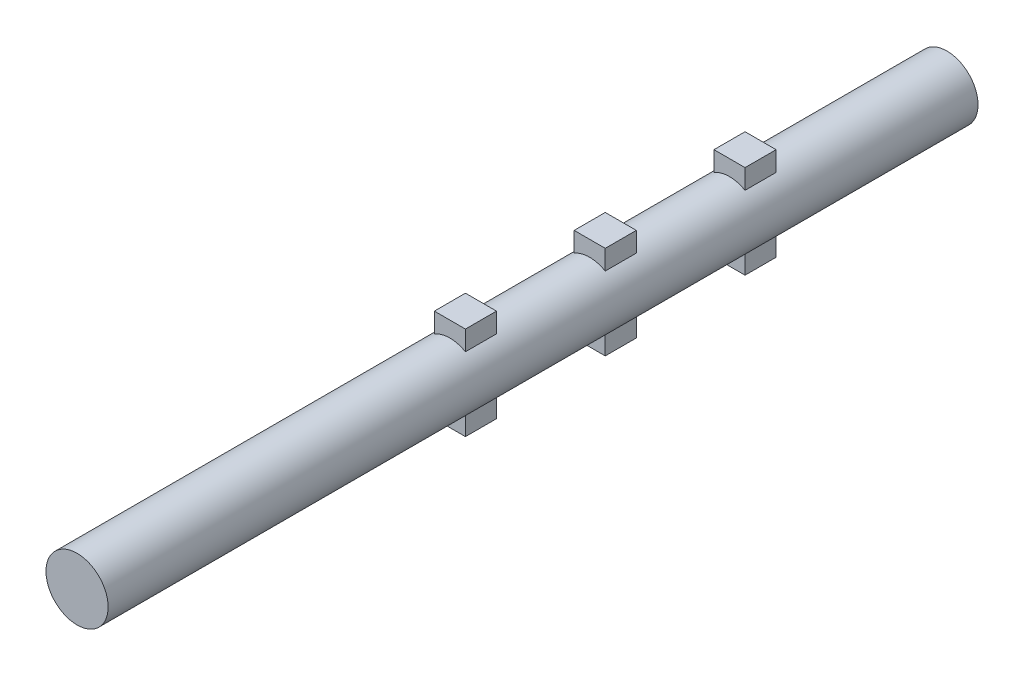
ISO-10303-21;
HEADER;
FILE_DESCRIPTION(('STEP AP214'),'2;1');
FILE_NAME('part.step','',(''),(''),'','','');
FILE_SCHEMA(('AUTOMOTIVE_DESIGN { 1 0 10303 214 1 1 1 1 }'));
ENDSEC;
DATA;
#1=APPLICATION_CONTEXT('core data for automotive mechanical design processes');
#2=APPLICATION_PROTOCOL_DEFINITION('international standard','automotive_design',2000,#1);
#3=PRODUCT_CONTEXT('',#1,'mechanical');
#4=PRODUCT('Part','Part','',(#3));
#5=PRODUCT_RELATED_PRODUCT_CATEGORY('part','',(#4));
#6=PRODUCT_DEFINITION_FORMATION('','',#4);
#7=PRODUCT_DEFINITION_CONTEXT('part definition',#1,'design');
#8=PRODUCT_DEFINITION('design','',#6,#7);
#9=PRODUCT_DEFINITION_SHAPE('','',#8);
#10=(LENGTH_UNIT() NAMED_UNIT(*) SI_UNIT(.MILLI.,.METRE.));
#11=(NAMED_UNIT(*) PLANE_ANGLE_UNIT() SI_UNIT($,.RADIAN.));
#12=(NAMED_UNIT(*) SI_UNIT($,.STERADIAN.) SOLID_ANGLE_UNIT());
#13=UNCERTAINTY_MEASURE_WITH_UNIT(LENGTH_MEASURE(1.E-05),#10,'distance_accuracy_value','');
#14=(GEOMETRIC_REPRESENTATION_CONTEXT(3) GLOBAL_UNCERTAINTY_ASSIGNED_CONTEXT((#13)) GLOBAL_UNIT_ASSIGNED_CONTEXT((#10,
#11,#12)) REPRESENTATION_CONTEXT('',''));
#15=CARTESIAN_POINT('',(0.,0.,0.));
#16=DIRECTION('',(0.,0.,1.));
#17=DIRECTION('',(1.,0.,0.));
#18=AXIS2_PLACEMENT_3D('',#15,#16,#17);
#19=CARTESIAN_POINT('',(0.,0.,25.));
#20=DIRECTION('',(0.,0.,1.));
#21=DIRECTION('',(1.,0.,0.));
#22=AXIS2_PLACEMENT_3D('',#19,#20,#21);
#23=PLANE('',#22);
#24=CARTESIAN_POINT('',(0.,0.,25.));
#25=DIRECTION('',(0.,0.,1.));
#26=DIRECTION('',(1.,0.,0.));
#27=AXIS2_PLACEMENT_3D('',#24,#25,#26);
#28=CIRCLE('',#27,5.);
#29=CARTESIAN_POINT('',(2.5,4.33012701892219,25.));
#30=VERTEX_POINT('',#29);
#31=CARTESIAN_POINT('',(-2.5,4.33012701892219,25.));
#32=VERTEX_POINT('',#31);
#33=EDGE_CURVE('E53',#30,#32,#28,.T.);
#34=ORIENTED_EDGE('',*,*,#33,.F.);
#35=DIRECTION('',(0.,1.,0.));
#36=VECTOR('',#35,1.);
#37=CARTESIAN_POINT('',(2.5,-7.5,25.));
#38=LINE('',#37,#36);
#39=CARTESIAN_POINT('',(2.5,7.5,25.));
#40=VERTEX_POINT('',#39);
#41=EDGE_CURVE('E222',#30,#40,#38,.T.);
#42=ORIENTED_EDGE('',*,*,#41,.T.);
#43=DIRECTION('',(-1.,0.,0.));
#44=VECTOR('',#43,1.);
#45=CARTESIAN_POINT('',(-2.5,7.5,25.));
#46=LINE('',#45,#44);
#47=CARTESIAN_POINT('',(-2.5,7.5,25.));
#48=VERTEX_POINT('',#47);
#49=EDGE_CURVE('E397',#40,#48,#46,.T.);
#50=ORIENTED_EDGE('',*,*,#49,.T.);
#51=DIRECTION('',(0.,-1.,0.));
#52=VECTOR('',#51,1.);
#53=CARTESIAN_POINT('',(-2.5,-7.5,25.));
#54=LINE('',#53,#52);
#55=EDGE_CURVE('E234',#48,#32,#54,.T.);
#56=ORIENTED_EDGE('',*,*,#55,.T.);
#57=EDGE_LOOP('',(#34,#42,#50,#56));
#58=FACE_BOUND('',#57,.T.);
#59=ADVANCED_FACE('F40',(#58),#23,.T.);
#60=CARTESIAN_POINT('',(0.,0.,-25.));
#61=DIRECTION('',(0.,0.,-1.));
#62=DIRECTION('',(-1.,0.,0.));
#63=AXIS2_PLACEMENT_3D('',#60,#61,#62);
#64=PLANE('',#63);
#65=CARTESIAN_POINT('',(0.,0.,-25.));
#66=DIRECTION('',(0.,0.,-1.));
#67=DIRECTION('',(-1.,0.,0.));
#68=AXIS2_PLACEMENT_3D('',#65,#66,#67);
#69=CIRCLE('',#68,5.);
#70=CARTESIAN_POINT('',(-2.5,4.33012701892219,-25.));
#71=VERTEX_POINT('',#70);
#72=CARTESIAN_POINT('',(2.5,4.33012701892219,-25.));
#73=VERTEX_POINT('',#72);
#74=EDGE_CURVE('E247',#71,#73,#69,.T.);
#75=ORIENTED_EDGE('',*,*,#74,.F.);
#76=DIRECTION('',(0.,1.,0.));
#77=VECTOR('',#76,1.);
#78=CARTESIAN_POINT('',(-2.5,-7.5,-25.));
#79=LINE('',#78,#77);
#80=CARTESIAN_POINT('',(-2.5,7.5,-25.));
#81=VERTEX_POINT('',#80);
#82=EDGE_CURVE('E283',#71,#81,#79,.T.);
#83=ORIENTED_EDGE('',*,*,#82,.T.);
#84=DIRECTION('',(1.,0.,0.));
#85=VECTOR('',#84,1.);
#86=CARTESIAN_POINT('',(-2.5,7.5,-25.));
#87=LINE('',#86,#85);
#88=CARTESIAN_POINT('',(2.5,7.5,-25.));
#89=VERTEX_POINT('',#88);
#90=EDGE_CURVE('E286',#81,#89,#87,.T.);
#91=ORIENTED_EDGE('',*,*,#90,.T.);
#92=DIRECTION('',(0.,-1.,0.));
#93=VECTOR('',#92,1.);
#94=CARTESIAN_POINT('',(2.5,-7.5,-25.));
#95=LINE('',#94,#93);
#96=EDGE_CURVE('E68',#89,#73,#95,.T.);
#97=ORIENTED_EDGE('',*,*,#96,.T.);
#98=EDGE_LOOP('',(#75,#83,#91,#97));
#99=FACE_BOUND('',#98,.T.);
#100=ADVANCED_FACE('F505',(#99),#64,.T.);
#101=CARTESIAN_POINT('',(2.5,-7.5,2.5));
#102=DIRECTION('',(1.,0.,0.));
#103=DIRECTION('',(0.,0.,-1.));
#104=AXIS2_PLACEMENT_3D('',#101,#102,#103);
#105=PLANE('',#104);
#106=DIRECTION('',(0.,0.,-1.));
#107=VECTOR('',#106,1.);
#108=CARTESIAN_POINT('',(2.5,4.33012701892219,25.));
#109=LINE('',#108,#107);
#110=CARTESIAN_POINT('',(2.5,4.33012701892219,-2.5));
#111=VERTEX_POINT('',#110);
#112=CARTESIAN_POINT('',(2.5,4.33012701892219,2.5));
#113=VERTEX_POINT('',#112);
#114=EDGE_CURVE('E357',#111,#113,#109,.F.);
#115=ORIENTED_EDGE('',*,*,#114,.F.);
#116=DIRECTION('',(0.,-1.,0.));
#117=VECTOR('',#116,1.);
#118=CARTESIAN_POINT('',(2.5,-7.5,-2.5));
#119=LINE('',#118,#117);
#120=CARTESIAN_POINT('',(2.5,7.5,-2.5));
#121=VERTEX_POINT('',#120);
#122=EDGE_CURVE('E327',#121,#111,#119,.T.);
#123=ORIENTED_EDGE('',*,*,#122,.F.);
#124=DIRECTION('',(0.,0.,-1.));
#125=VECTOR('',#124,1.);
#126=CARTESIAN_POINT('',(2.5,7.5,2.5));
#127=LINE('',#126,#125);
#128=CARTESIAN_POINT('',(2.5,7.5,2.5));
#129=VERTEX_POINT('',#128);
#130=EDGE_CURVE('E362',#129,#121,#127,.T.);
#131=ORIENTED_EDGE('',*,*,#130,.F.);
#132=DIRECTION('',(0.,-1.,0.));
#133=VECTOR('',#132,1.);
#134=CARTESIAN_POINT('',(2.5,-7.5,2.5));
#135=LINE('',#134,#133);
#136=EDGE_CURVE('E345',#129,#113,#135,.T.);
#137=ORIENTED_EDGE('',*,*,#136,.T.);
#138=EDGE_LOOP('',(#115,#123,#131,#137));
#139=FACE_BOUND('',#138,.T.);
#140=ADVANCED_FACE('F510',(#139),#105,.T.);
#141=CARTESIAN_POINT('',(2.5,-4.33012701892219,-2.5));
#142=VERTEX_POINT('',#141);
#143=CARTESIAN_POINT('',(2.5,-7.5,-2.5));
#144=VERTEX_POINT('',#143);
#145=EDGE_CURVE('E326',#142,#144,#119,.T.);
#146=ORIENTED_EDGE('',*,*,#145,.F.);
#147=DIRECTION('',(0.,0.,-1.));
#148=VECTOR('',#147,1.);
#149=CARTESIAN_POINT('',(2.5,-4.33012701892219,25.));
#150=LINE('',#149,#148);
#151=CARTESIAN_POINT('',(2.5,-4.33012701892219,2.5));
#152=VERTEX_POINT('',#151);
#153=EDGE_CURVE('E370',#152,#142,#150,.T.);
#154=ORIENTED_EDGE('',*,*,#153,.F.);
#155=CARTESIAN_POINT('',(2.5,-7.5,2.5));
#156=VERTEX_POINT('',#155);
#157=EDGE_CURVE('E344',#152,#156,#135,.T.);
#158=ORIENTED_EDGE('',*,*,#157,.T.);
#159=DIRECTION('',(0.,0.,-1.));
#160=VECTOR('',#159,1.);
#161=CARTESIAN_POINT('',(2.5,-7.5,2.5));
#162=LINE('',#161,#160);
#163=EDGE_CURVE('E358',#156,#144,#162,.T.);
#164=ORIENTED_EDGE('',*,*,#163,.T.);
#165=EDGE_LOOP('',(#146,#154,#158,#164));
#166=FACE_BOUND('',#165,.T.);
#167=ADVANCED_FACE('F566',(#166),#105,.T.);
#168=CARTESIAN_POINT('',(-2.5,-7.5,2.5));
#169=DIRECTION('',(-1.,0.,0.));
#170=DIRECTION('',(0.,0.,1.));
#171=AXIS2_PLACEMENT_3D('',#168,#169,#170);
#172=PLANE('',#171);
#173=DIRECTION('',(0.,0.,-1.));
#174=VECTOR('',#173,1.);
#175=CARTESIAN_POINT('',(-2.5,-4.33012701892219,25.));
#176=LINE('',#175,#174);
#177=CARTESIAN_POINT('',(-2.5,-4.33012701892219,-2.5));
#178=VERTEX_POINT('',#177);
#179=CARTESIAN_POINT('',(-2.5,-4.33012701892219,2.5));
#180=VERTEX_POINT('',#179);
#181=EDGE_CURVE('E373',#178,#180,#176,.F.);
#182=ORIENTED_EDGE('',*,*,#181,.F.);
#183=DIRECTION('',(0.,1.,0.));
#184=VECTOR('',#183,1.);
#185=CARTESIAN_POINT('',(-2.5,-7.5,-2.5));
#186=LINE('',#185,#184);
#187=CARTESIAN_POINT('',(-2.5,-7.5,-2.5));
#188=VERTEX_POINT('',#187);
#189=EDGE_CURVE('E318',#188,#178,#186,.T.);
#190=ORIENTED_EDGE('',*,*,#189,.F.);
#191=DIRECTION('',(0.,0.,-1.));
#192=VECTOR('',#191,1.);
#193=CARTESIAN_POINT('',(-2.5,-7.5,2.5));
#194=LINE('',#193,#192);
#195=CARTESIAN_POINT('',(-2.5,-7.5,2.5));
#196=VERTEX_POINT('',#195);
#197=EDGE_CURVE('E354',#196,#188,#194,.T.);
#198=ORIENTED_EDGE('',*,*,#197,.F.);
#199=DIRECTION('',(0.,1.,0.));
#200=VECTOR('',#199,1.);
#201=CARTESIAN_POINT('',(-2.5,-7.5,2.5));
#202=LINE('',#201,#200);
#203=EDGE_CURVE('E336',#196,#180,#202,.T.);
#204=ORIENTED_EDGE('',*,*,#203,.T.);
#205=EDGE_LOOP('',(#182,#190,#198,#204));
#206=FACE_BOUND('',#205,.T.);
#207=ADVANCED_FACE('F563',(#206),#172,.T.);
#208=CARTESIAN_POINT('',(-2.5,4.33012701892219,-2.5));
#209=VERTEX_POINT('',#208);
#210=CARTESIAN_POINT('',(-2.5,7.5,-2.5));
#211=VERTEX_POINT('',#210);
#212=EDGE_CURVE('E317',#209,#211,#186,.T.);
#213=ORIENTED_EDGE('',*,*,#212,.F.);
#214=DIRECTION('',(0.,0.,-1.));
#215=VECTOR('',#214,1.);
#216=CARTESIAN_POINT('',(-2.5,4.33012701892219,25.));
#217=LINE('',#216,#215);
#218=CARTESIAN_POINT('',(-2.5,4.33012701892219,2.5));
#219=VERTEX_POINT('',#218);
#220=EDGE_CURVE('E231',#219,#209,#217,.T.);
#221=ORIENTED_EDGE('',*,*,#220,.F.);
#222=CARTESIAN_POINT('',(-2.5,7.5,2.5));
#223=VERTEX_POINT('',#222);
#224=EDGE_CURVE('E335',#219,#223,#202,.T.);
#225=ORIENTED_EDGE('',*,*,#224,.T.);
#226=DIRECTION('',(0.,0.,-1.));
#227=VECTOR('',#226,1.);
#228=CARTESIAN_POINT('',(-2.5,7.5,2.5));
#229=LINE('',#228,#227);
#230=EDGE_CURVE('E353',#223,#211,#229,.T.);
#231=ORIENTED_EDGE('',*,*,#230,.T.);
#232=EDGE_LOOP('',(#213,#221,#225,#231));
#233=FACE_BOUND('',#232,.T.);
#234=ADVANCED_FACE('F452',(#233),#172,.T.);
#235=CARTESIAN_POINT('',(0.,0.,-2.5));
#236=DIRECTION('',(0.,0.,1.));
#237=DIRECTION('',(1.,0.,0.));
#238=AXIS2_PLACEMENT_3D('',#235,#236,#237);
#239=PLANE('',#238);
#240=CARTESIAN_POINT('',(0.,0.,-2.5));
#241=DIRECTION('',(0.,0.,1.));
#242=DIRECTION('',(1.,0.,0.));
#243=AXIS2_PLACEMENT_3D('',#240,#241,#242);
#244=CIRCLE('',#243,5.);
#245=EDGE_CURVE('E438',#142,#178,#244,.F.);
#246=ORIENTED_EDGE('',*,*,#245,.F.);
#247=ORIENTED_EDGE('',*,*,#145,.T.);
#248=DIRECTION('',(-1.,0.,0.));
#249=VECTOR('',#248,1.);
#250=CARTESIAN_POINT('',(2.5,-7.5,-2.5));
#251=LINE('',#250,#249);
#252=EDGE_CURVE('E331',#144,#188,#251,.T.);
#253=ORIENTED_EDGE('',*,*,#252,.T.);
#254=ORIENTED_EDGE('',*,*,#189,.T.);
#255=EDGE_LOOP('',(#246,#247,#253,#254));
#256=FACE_BOUND('',#255,.T.);
#257=ADVANCED_FACE('F523',(#256),#239,.F.);
#258=CARTESIAN_POINT('',(0.,0.,25.));
#259=DIRECTION('',(0.,0.,-1.));
#260=DIRECTION('',(-1.,0.,0.));
#261=AXIS2_PLACEMENT_3D('',#258,#259,#260);
#262=CYLINDRICAL_SURFACE('',#261,5.);
#263=DIRECTION('',(0.,0.,-1.));
#264=VECTOR('',#263,1.);
#265=CARTESIAN_POINT('',(-2.5,-4.33012701892219,25.));
#266=LINE('',#265,#264);
#267=CARTESIAN_POINT('',(-2.5,-4.33012701892219,20.));
#268=VERTEX_POINT('',#267);
#269=CARTESIAN_POINT('',(-2.5,-4.33012701892219,25.));
#270=VERTEX_POINT('',#269);
#271=EDGE_CURVE('E410',#268,#270,#266,.F.);
#272=ORIENTED_EDGE('',*,*,#271,.T.);
#273=CARTESIAN_POINT('',(2.5,-4.33012701892219,25.));
#274=VERTEX_POINT('',#273);
#275=EDGE_CURVE('E11',#270,#274,#28,.T.);
#276=ORIENTED_EDGE('',*,*,#275,.T.);
#277=DIRECTION('',(0.,0.,-1.));
#278=VECTOR('',#277,1.);
#279=CARTESIAN_POINT('',(2.5,-4.33012701892219,25.));
#280=LINE('',#279,#278);
#281=CARTESIAN_POINT('',(2.5,-4.33012701892219,20.));
#282=VERTEX_POINT('',#281);
#283=EDGE_CURVE('E218',#274,#282,#280,.T.);
#284=ORIENTED_EDGE('',*,*,#283,.T.);
#285=CARTESIAN_POINT('',(0.,0.,20.));
#286=DIRECTION('',(0.,0.,-1.));
#287=DIRECTION('',(-1.,0.,0.));
#288=AXIS2_PLACEMENT_3D('',#285,#286,#287);
#289=CIRCLE('',#288,5.);
#290=EDGE_CURVE('E428',#282,#268,#289,.T.);
#291=ORIENTED_EDGE('',*,*,#290,.T.);
#292=EDGE_LOOP('',(#272,#276,#284,#291));
#293=FACE_BOUND('',#292,.T.);
#294=DIRECTION('',(0.,0.,-1.));
#295=VECTOR('',#294,1.);
#296=CARTESIAN_POINT('',(2.5,-4.33012701892219,25.));
#297=LINE('',#296,#295);
#298=CARTESIAN_POINT('',(2.5,-4.33012701892219,-20.));
#299=VERTEX_POINT('',#298);
#300=CARTESIAN_POINT('',(2.5,-4.33012701892219,-25.));
#301=VERTEX_POINT('',#300);
#302=EDGE_CURVE('E313',#299,#301,#297,.T.);
#303=ORIENTED_EDGE('',*,*,#302,.T.);
#304=CARTESIAN_POINT('',(-2.5,-4.33012701892219,-25.));
#305=VERTEX_POINT('',#304);
#306=EDGE_CURVE('E51',#301,#305,#69,.T.);
#307=ORIENTED_EDGE('',*,*,#306,.T.);
#308=DIRECTION('',(0.,0.,-1.));
#309=VECTOR('',#308,1.);
#310=CARTESIAN_POINT('',(-2.5,-4.33012701892219,25.));
#311=LINE('',#310,#309);
#312=CARTESIAN_POINT('',(-2.5,-4.33012701892219,-20.));
#313=VERTEX_POINT('',#312);
#314=EDGE_CURVE('E292',#305,#313,#311,.F.);
#315=ORIENTED_EDGE('',*,*,#314,.T.);
#316=CARTESIAN_POINT('',(0.,0.,-20.));
#317=DIRECTION('',(0.,0.,-1.));
#318=DIRECTION('',(-1.,0.,0.));
#319=AXIS2_PLACEMENT_3D('',#316,#317,#318);
#320=CIRCLE('',#319,5.);
#321=EDGE_CURVE('E44',#299,#313,#320,.T.);
#322=ORIENTED_EDGE('',*,*,#321,.F.);
#323=EDGE_LOOP('',(#303,#307,#315,#322));
#324=FACE_BOUND('',#323,.T.);
#325=ORIENTED_EDGE('',*,*,#74,.T.);
#326=DIRECTION('',(0.,0.,-1.));
#327=VECTOR('',#326,1.);
#328=CARTESIAN_POINT('',(2.5,4.33012701892219,25.));
#329=LINE('',#328,#327);
#330=CARTESIAN_POINT('',(2.5,4.33012701892219,-20.));
#331=VERTEX_POINT('',#330);
#332=EDGE_CURVE('E309',#73,#331,#329,.F.);
#333=ORIENTED_EDGE('',*,*,#332,.T.);
#334=CARTESIAN_POINT('',(-2.5,4.33012701892219,-20.));
#335=VERTEX_POINT('',#334);
#336=EDGE_CURVE('E481',#335,#331,#320,.T.);
#337=ORIENTED_EDGE('',*,*,#336,.F.);
#338=DIRECTION('',(0.,0.,-1.));
#339=VECTOR('',#338,1.);
#340=CARTESIAN_POINT('',(-2.5,4.33012701892219,25.));
#341=LINE('',#340,#339);
#342=EDGE_CURVE('E306',#335,#71,#341,.T.);
#343=ORIENTED_EDGE('',*,*,#342,.T.);
#344=EDGE_LOOP('',(#325,#333,#337,#343));
#345=FACE_BOUND('',#344,.T.);
#346=EDGE_CURVE('E435',#209,#111,#244,.F.);
#347=ORIENTED_EDGE('',*,*,#346,.T.);
#348=ORIENTED_EDGE('',*,*,#114,.T.);
#349=CARTESIAN_POINT('',(0.,0.,2.5));
#350=DIRECTION('',(0.,0.,1.));
#351=DIRECTION('',(1.,0.,0.));
#352=AXIS2_PLACEMENT_3D('',#349,#350,#351);
#353=CIRCLE('',#352,5.);
#354=EDGE_CURVE('E434',#113,#219,#353,.T.);
#355=ORIENTED_EDGE('',*,*,#354,.T.);
#356=ORIENTED_EDGE('',*,*,#220,.T.);
#357=EDGE_LOOP('',(#347,#348,#355,#356));
#358=FACE_BOUND('',#357,.T.);
#359=ORIENTED_EDGE('',*,*,#153,.T.);
#360=ORIENTED_EDGE('',*,*,#245,.T.);
#361=ORIENTED_EDGE('',*,*,#181,.T.);
#362=EDGE_CURVE('E432',#180,#152,#353,.T.);
#363=ORIENTED_EDGE('',*,*,#362,.T.);
#364=EDGE_LOOP('',(#359,#360,#361,#363));
#365=FACE_BOUND('',#364,.T.);
#366=CARTESIAN_POINT('',(-2.5,4.33012701892219,20.));
#367=VERTEX_POINT('',#366);
#368=CARTESIAN_POINT('',(2.5,4.33012701892219,20.));
#369=VERTEX_POINT('',#368);
#370=EDGE_CURVE('E214',#367,#369,#289,.T.);
#371=ORIENTED_EDGE('',*,*,#370,.T.);
#372=DIRECTION('',(0.,0.,-1.));
#373=VECTOR('',#372,1.);
#374=CARTESIAN_POINT('',(2.5,4.33012701892219,25.));
#375=LINE('',#374,#373);
#376=EDGE_CURVE('E209',#369,#30,#375,.F.);
#377=ORIENTED_EDGE('',*,*,#376,.T.);
#378=ORIENTED_EDGE('',*,*,#33,.T.);
#379=DIRECTION('',(0.,0.,-1.));
#380=VECTOR('',#379,1.);
#381=CARTESIAN_POINT('',(-2.5,4.33012701892219,25.));
#382=LINE('',#381,#380);
#383=EDGE_CURVE('E219',#32,#367,#382,.T.);
#384=ORIENTED_EDGE('',*,*,#383,.T.);
#385=EDGE_LOOP('',(#371,#377,#378,#384));
#386=FACE_BOUND('',#385,.T.);
#387=CARTESIAN_POINT('',(0.,0.,85.));
#388=DIRECTION('',(0.,0.,1.));
#389=DIRECTION('',(1.,0.,0.));
#390=AXIS2_PLACEMENT_3D('',#387,#388,#389);
#391=CIRCLE('',#390,5.);
#392=CARTESIAN_POINT('',(5.,0.,85.));
#393=VERTEX_POINT('',#392);
#394=EDGE_CURVE('E237',#393,#393,#391,.T.);
#395=ORIENTED_EDGE('',*,*,#394,.F.);
#396=EDGE_LOOP('',(#395));
#397=FACE_BOUND('',#396,.T.);
#398=CARTESIAN_POINT('',(0.,0.,-55.));
#399=DIRECTION('',(0.,0.,-1.));
#400=DIRECTION('',(-1.,0.,0.));
#401=AXIS2_PLACEMENT_3D('',#398,#399,#400);
#402=CIRCLE('',#401,5.);
#403=CARTESIAN_POINT('',(-5.,0.,-55.));
#404=VERTEX_POINT('',#403);
#405=EDGE_CURVE('E238',#404,#404,#402,.T.);
#406=ORIENTED_EDGE('',*,*,#405,.F.);
#407=EDGE_LOOP('',(#406));
#408=FACE_BOUND('',#407,.T.);
#409=ADVANCED_FACE('F42',(#293,#324,#345,#358,#365,#386,#397,#408),#262,.T.);
#410=ORIENTED_EDGE('',*,*,#275,.F.);
#411=CARTESIAN_POINT('',(-2.5,-7.5,25.));
#412=VERTEX_POINT('',#411);
#413=EDGE_CURVE('E400',#270,#412,#54,.T.);
#414=ORIENTED_EDGE('',*,*,#413,.T.);
#415=DIRECTION('',(1.,0.,0.));
#416=VECTOR('',#415,1.);
#417=CARTESIAN_POINT('',(-2.5,-7.5,25.));
#418=LINE('',#417,#416);
#419=CARTESIAN_POINT('',(2.5,-7.5,25.));
#420=VERTEX_POINT('',#419);
#421=EDGE_CURVE('E403',#412,#420,#418,.T.);
#422=ORIENTED_EDGE('',*,*,#421,.T.);
#423=EDGE_CURVE('E230',#420,#274,#38,.T.);
#424=ORIENTED_EDGE('',*,*,#423,.T.);
#425=EDGE_LOOP('',(#410,#414,#422,#424));
#426=FACE_BOUND('',#425,.T.);
#427=ADVANCED_FACE('F506',(#426),#23,.T.);
#428=CARTESIAN_POINT('',(-2.5,-7.5,20.));
#429=DIRECTION('',(0.,-1.,0.));
#430=DIRECTION('',(0.,0.,-1.));
#431=AXIS2_PLACEMENT_3D('',#428,#429,#430);
#432=PLANE('',#431);
#433=ORIENTED_EDGE('',*,*,#421,.F.);
#434=DIRECTION('',(0.,0.,1.));
#435=VECTOR('',#434,1.);
#436=CARTESIAN_POINT('',(-2.5,-7.5,20.));
#437=LINE('',#436,#435);
#438=CARTESIAN_POINT('',(-2.5,-7.5,20.));
#439=VERTEX_POINT('',#438);
#440=EDGE_CURVE('E411',#439,#412,#437,.T.);
#441=ORIENTED_EDGE('',*,*,#440,.F.);
#442=DIRECTION('',(1.,0.,0.));
#443=VECTOR('',#442,1.);
#444=CARTESIAN_POINT('',(-2.5,-7.5,20.));
#445=LINE('',#444,#443);
#446=CARTESIAN_POINT('',(2.5,-7.5,20.));
#447=VERTEX_POINT('',#446);
#448=EDGE_CURVE('E392',#439,#447,#445,.T.);
#449=ORIENTED_EDGE('',*,*,#448,.T.);
#450=DIRECTION('',(0.,0.,1.));
#451=VECTOR('',#450,1.);
#452=CARTESIAN_POINT('',(2.5,-7.5,20.));
#453=LINE('',#452,#451);
#454=EDGE_CURVE('E407',#447,#420,#453,.T.);
#455=ORIENTED_EDGE('',*,*,#454,.T.);
#456=EDGE_LOOP('',(#433,#441,#449,#455));
#457=FACE_BOUND('',#456,.T.);
#458=ADVANCED_FACE('F514',(#457),#432,.T.);
#459=CARTESIAN_POINT('',(0.,0.,20.));
#460=DIRECTION('',(0.,0.,-1.));
#461=DIRECTION('',(-1.,0.,0.));
#462=AXIS2_PLACEMENT_3D('',#459,#460,#461);
#463=PLANE('',#462);
#464=ORIENTED_EDGE('',*,*,#290,.F.);
#465=DIRECTION('',(0.,1.,0.));
#466=VECTOR('',#465,1.);
#467=CARTESIAN_POINT('',(2.5,-7.5,20.));
#468=LINE('',#467,#466);
#469=EDGE_CURVE('E378',#447,#282,#468,.T.);
#470=ORIENTED_EDGE('',*,*,#469,.F.);
#471=ORIENTED_EDGE('',*,*,#448,.F.);
#472=DIRECTION('',(0.,-1.,0.));
#473=VECTOR('',#472,1.);
#474=CARTESIAN_POINT('',(-2.5,-7.5,20.));
#475=LINE('',#474,#473);
#476=EDGE_CURVE('E387',#268,#439,#475,.T.);
#477=ORIENTED_EDGE('',*,*,#476,.F.);
#478=EDGE_LOOP('',(#464,#470,#471,#477));
#479=FACE_BOUND('',#478,.T.);
#480=ADVANCED_FACE('F520',(#479),#463,.T.);
#481=CARTESIAN_POINT('',(-2.5,-7.5,20.));
#482=DIRECTION('',(-1.,0.,0.));
#483=DIRECTION('',(0.,0.,1.));
#484=AXIS2_PLACEMENT_3D('',#481,#482,#483);
#485=PLANE('',#484);
#486=ORIENTED_EDGE('',*,*,#271,.F.);
#487=ORIENTED_EDGE('',*,*,#476,.T.);
#488=ORIENTED_EDGE('',*,*,#440,.T.);
#489=ORIENTED_EDGE('',*,*,#413,.F.);
#490=EDGE_LOOP('',(#486,#487,#488,#489));
#491=FACE_BOUND('',#490,.T.);
#492=ADVANCED_FACE('F529',(#491),#485,.T.);
#493=CARTESIAN_POINT('',(2.5,-7.5,20.));
#494=DIRECTION('',(1.,0.,0.));
#495=DIRECTION('',(0.,0.,-1.));
#496=AXIS2_PLACEMENT_3D('',#493,#494,#495);
#497=PLANE('',#496);
#498=ORIENTED_EDGE('',*,*,#283,.F.);
#499=ORIENTED_EDGE('',*,*,#423,.F.);
#500=ORIENTED_EDGE('',*,*,#454,.F.);
#501=ORIENTED_EDGE('',*,*,#469,.T.);
#502=EDGE_LOOP('',(#498,#499,#500,#501));
#503=FACE_BOUND('',#502,.T.);
#504=ADVANCED_FACE('F538',(#503),#497,.T.);
#505=ORIENTED_EDGE('',*,*,#370,.F.);
#506=CARTESIAN_POINT('',(-2.5,7.5,20.));
#507=VERTEX_POINT('',#506);
#508=EDGE_CURVE('E388',#507,#367,#475,.T.);
#509=ORIENTED_EDGE('',*,*,#508,.F.);
#510=DIRECTION('',(-1.,0.,0.));
#511=VECTOR('',#510,1.);
#512=CARTESIAN_POINT('',(-2.5,7.5,20.));
#513=LINE('',#512,#511);
#514=CARTESIAN_POINT('',(2.5,7.5,20.));
#515=VERTEX_POINT('',#514);
#516=EDGE_CURVE('E382',#515,#507,#513,.T.);
#517=ORIENTED_EDGE('',*,*,#516,.F.);
#518=EDGE_CURVE('E383',#369,#515,#468,.T.);
#519=ORIENTED_EDGE('',*,*,#518,.F.);
#520=EDGE_LOOP('',(#505,#509,#517,#519));
#521=FACE_BOUND('',#520,.T.);
#522=ADVANCED_FACE('F540',(#521),#463,.T.);
#523=ORIENTED_EDGE('',*,*,#376,.F.);
#524=ORIENTED_EDGE('',*,*,#518,.T.);
#525=DIRECTION('',(0.,0.,1.));
#526=VECTOR('',#525,1.);
#527=CARTESIAN_POINT('',(2.5,7.5,20.));
#528=LINE('',#527,#526);
#529=EDGE_CURVE('E225',#515,#40,#528,.T.);
#530=ORIENTED_EDGE('',*,*,#529,.T.);
#531=ORIENTED_EDGE('',*,*,#41,.F.);
#532=EDGE_LOOP('',(#523,#524,#530,#531));
#533=FACE_BOUND('',#532,.T.);
#534=ADVANCED_FACE('F223',(#533),#497,.T.);
#535=ORIENTED_EDGE('',*,*,#383,.F.);
#536=ORIENTED_EDGE('',*,*,#55,.F.);
#537=DIRECTION('',(0.,0.,1.));
#538=VECTOR('',#537,1.);
#539=CARTESIAN_POINT('',(-2.5,7.5,20.));
#540=LINE('',#539,#538);
#541=EDGE_CURVE('E415',#507,#48,#540,.T.);
#542=ORIENTED_EDGE('',*,*,#541,.F.);
#543=ORIENTED_EDGE('',*,*,#508,.T.);
#544=EDGE_LOOP('',(#535,#536,#542,#543));
#545=FACE_BOUND('',#544,.T.);
#546=ADVANCED_FACE('F548',(#545),#485,.T.);
#547=CARTESIAN_POINT('',(-2.5,7.5,20.));
#548=DIRECTION('',(0.,1.,0.));
#549=DIRECTION('',(0.,0.,1.));
#550=AXIS2_PLACEMENT_3D('',#547,#548,#549);
#551=PLANE('',#550);
#552=ORIENTED_EDGE('',*,*,#49,.F.);
#553=ORIENTED_EDGE('',*,*,#529,.F.);
#554=ORIENTED_EDGE('',*,*,#516,.T.);
#555=ORIENTED_EDGE('',*,*,#541,.T.);
#556=EDGE_LOOP('',(#552,#553,#554,#555));
#557=FACE_BOUND('',#556,.T.);
#558=ADVANCED_FACE('F554',(#557),#551,.T.);
#559=CARTESIAN_POINT('',(2.5,-7.5,2.5));
#560=DIRECTION('',(0.,-1.,0.));
#561=DIRECTION('',(0.,0.,-1.));
#562=AXIS2_PLACEMENT_3D('',#559,#560,#561);
#563=PLANE('',#562);
#564=ORIENTED_EDGE('',*,*,#197,.T.);
#565=ORIENTED_EDGE('',*,*,#252,.F.);
#566=ORIENTED_EDGE('',*,*,#163,.F.);
#567=DIRECTION('',(-1.,0.,0.));
#568=VECTOR('',#567,1.);
#569=CARTESIAN_POINT('',(2.5,-7.5,2.5));
#570=LINE('',#569,#568);
#571=EDGE_CURVE('E349',#156,#196,#570,.T.);
#572=ORIENTED_EDGE('',*,*,#571,.T.);
#573=EDGE_LOOP('',(#564,#565,#566,#572));
#574=FACE_BOUND('',#573,.T.);
#575=ADVANCED_FACE('F559',(#574),#563,.T.);
#576=CARTESIAN_POINT('',(0.,0.,2.5));
#577=DIRECTION('',(0.,0.,1.));
#578=DIRECTION('',(1.,0.,0.));
#579=AXIS2_PLACEMENT_3D('',#576,#577,#578);
#580=PLANE('',#579);
#581=ORIENTED_EDGE('',*,*,#362,.F.);
#582=ORIENTED_EDGE('',*,*,#203,.F.);
#583=ORIENTED_EDGE('',*,*,#571,.F.);
#584=ORIENTED_EDGE('',*,*,#157,.F.);
#585=EDGE_LOOP('',(#581,#582,#583,#584));
#586=FACE_BOUND('',#585,.T.);
#587=ADVANCED_FACE('F578',(#586),#580,.T.);
#588=ORIENTED_EDGE('',*,*,#354,.F.);
#589=ORIENTED_EDGE('',*,*,#136,.F.);
#590=DIRECTION('',(1.,0.,0.));
#591=VECTOR('',#590,1.);
#592=CARTESIAN_POINT('',(2.5,7.5,2.5));
#593=LINE('',#592,#591);
#594=EDGE_CURVE('E340',#223,#129,#593,.T.);
#595=ORIENTED_EDGE('',*,*,#594,.F.);
#596=ORIENTED_EDGE('',*,*,#224,.F.);
#597=EDGE_LOOP('',(#588,#589,#595,#596));
#598=FACE_BOUND('',#597,.T.);
#599=ADVANCED_FACE('F455',(#598),#580,.T.);
#600=CARTESIAN_POINT('',(2.5,7.5,2.5));
#601=DIRECTION('',(0.,1.,0.));
#602=DIRECTION('',(0.,0.,1.));
#603=AXIS2_PLACEMENT_3D('',#600,#601,#602);
#604=PLANE('',#603);
#605=ORIENTED_EDGE('',*,*,#130,.T.);
#606=DIRECTION('',(1.,0.,0.));
#607=VECTOR('',#606,1.);
#608=CARTESIAN_POINT('',(2.5,7.5,-2.5));
#609=LINE('',#608,#607);
#610=EDGE_CURVE('E322',#211,#121,#609,.T.);
#611=ORIENTED_EDGE('',*,*,#610,.F.);
#612=ORIENTED_EDGE('',*,*,#230,.F.);
#613=ORIENTED_EDGE('',*,*,#594,.T.);
#614=EDGE_LOOP('',(#605,#611,#612,#613));
#615=FACE_BOUND('',#614,.T.);
#616=ADVANCED_FACE('F568',(#615),#604,.T.);
#617=ORIENTED_EDGE('',*,*,#346,.F.);
#618=ORIENTED_EDGE('',*,*,#212,.T.);
#619=ORIENTED_EDGE('',*,*,#610,.T.);
#620=ORIENTED_EDGE('',*,*,#122,.T.);
#621=EDGE_LOOP('',(#617,#618,#619,#620));
#622=FACE_BOUND('',#621,.T.);
#623=ADVANCED_FACE('F571',(#622),#239,.F.);
#624=ORIENTED_EDGE('',*,*,#306,.F.);
#625=CARTESIAN_POINT('',(2.5,-7.5,-25.));
#626=VERTEX_POINT('',#625);
#627=EDGE_CURVE('E258',#301,#626,#95,.T.);
#628=ORIENTED_EDGE('',*,*,#627,.T.);
#629=DIRECTION('',(-1.,0.,0.));
#630=VECTOR('',#629,1.);
#631=CARTESIAN_POINT('',(-2.5,-7.5,-25.));
#632=LINE('',#631,#630);
#633=CARTESIAN_POINT('',(-2.5,-7.5,-25.));
#634=VERTEX_POINT('',#633);
#635=EDGE_CURVE('E280',#626,#634,#632,.T.);
#636=ORIENTED_EDGE('',*,*,#635,.T.);
#637=EDGE_CURVE('E60',#634,#305,#79,.T.);
#638=ORIENTED_EDGE('',*,*,#637,.T.);
#639=EDGE_LOOP('',(#624,#628,#636,#638));
#640=FACE_BOUND('',#639,.T.);
#641=ADVANCED_FACE('F464',(#640),#64,.T.);
#642=CARTESIAN_POINT('',(-2.5,-7.5,-20.));
#643=DIRECTION('',(0.,-1.,0.));
#644=DIRECTION('',(1.,0.,0.));
#645=AXIS2_PLACEMENT_3D('',#642,#643,#644);
#646=PLANE('',#645);
#647=ORIENTED_EDGE('',*,*,#635,.F.);
#648=DIRECTION('',(0.,0.,-1.));
#649=VECTOR('',#648,1.);
#650=CARTESIAN_POINT('',(2.5,-7.5,-20.));
#651=LINE('',#650,#649);
#652=CARTESIAN_POINT('',(2.5,-7.5,-20.));
#653=VERTEX_POINT('',#652);
#654=EDGE_CURVE('E277',#653,#626,#651,.T.);
#655=ORIENTED_EDGE('',*,*,#654,.F.);
#656=DIRECTION('',(-1.,0.,0.));
#657=VECTOR('',#656,1.);
#658=CARTESIAN_POINT('',(-2.5,-7.5,-20.));
#659=LINE('',#658,#657);
#660=CARTESIAN_POINT('',(-2.5,-7.5,-20.));
#661=VERTEX_POINT('',#660);
#662=EDGE_CURVE('E263',#653,#661,#659,.T.);
#663=ORIENTED_EDGE('',*,*,#662,.T.);
#664=DIRECTION('',(0.,0.,-1.));
#665=VECTOR('',#664,1.);
#666=CARTESIAN_POINT('',(-2.5,-7.5,-20.));
#667=LINE('',#666,#665);
#668=EDGE_CURVE('E297',#661,#634,#667,.T.);
#669=ORIENTED_EDGE('',*,*,#668,.T.);
#670=EDGE_LOOP('',(#647,#655,#663,#669));
#671=FACE_BOUND('',#670,.T.);
#672=ADVANCED_FACE('F473',(#671),#646,.T.);
#673=CARTESIAN_POINT('',(0.,0.,-20.));
#674=DIRECTION('',(0.,0.,-1.));
#675=DIRECTION('',(-1.,0.,0.));
#676=AXIS2_PLACEMENT_3D('',#673,#674,#675);
#677=PLANE('',#676);
#678=DIRECTION('',(0.,-1.,0.));
#679=VECTOR('',#678,1.);
#680=CARTESIAN_POINT('',(2.5,-7.5,-20.));
#681=LINE('',#680,#679);
#682=EDGE_CURVE('E264',#299,#653,#681,.T.);
#683=ORIENTED_EDGE('',*,*,#682,.F.);
#684=ORIENTED_EDGE('',*,*,#321,.T.);
#685=DIRECTION('',(0.,1.,0.));
#686=VECTOR('',#685,1.);
#687=CARTESIAN_POINT('',(-2.5,-7.5,-20.));
#688=LINE('',#687,#686);
#689=EDGE_CURVE('E269',#661,#313,#688,.T.);
#690=ORIENTED_EDGE('',*,*,#689,.F.);
#691=ORIENTED_EDGE('',*,*,#662,.F.);
#692=EDGE_LOOP('',(#683,#684,#690,#691));
#693=FACE_BOUND('',#692,.T.);
#694=ADVANCED_FACE('F489',(#693),#677,.F.);
#695=CARTESIAN_POINT('',(-2.5,-7.5,-20.));
#696=DIRECTION('',(-1.,0.,0.));
#697=DIRECTION('',(0.,0.,1.));
#698=AXIS2_PLACEMENT_3D('',#695,#696,#697);
#699=PLANE('',#698);
#700=ORIENTED_EDGE('',*,*,#314,.F.);
#701=ORIENTED_EDGE('',*,*,#637,.F.);
#702=ORIENTED_EDGE('',*,*,#668,.F.);
#703=ORIENTED_EDGE('',*,*,#689,.T.);
#704=EDGE_LOOP('',(#700,#701,#702,#703));
#705=FACE_BOUND('',#704,.T.);
#706=ADVANCED_FACE('F476',(#705),#699,.T.);
#707=CARTESIAN_POINT('',(2.5,-7.5,-20.));
#708=DIRECTION('',(1.,0.,0.));
#709=DIRECTION('',(0.,0.,-1.));
#710=AXIS2_PLACEMENT_3D('',#707,#708,#709);
#711=PLANE('',#710);
#712=ORIENTED_EDGE('',*,*,#302,.F.);
#713=ORIENTED_EDGE('',*,*,#682,.T.);
#714=ORIENTED_EDGE('',*,*,#654,.T.);
#715=ORIENTED_EDGE('',*,*,#627,.F.);
#716=EDGE_LOOP('',(#712,#713,#714,#715));
#717=FACE_BOUND('',#716,.T.);
#718=ADVANCED_FACE('F469',(#717),#711,.T.);
#719=CARTESIAN_POINT('',(-2.5,7.5,-20.));
#720=VERTEX_POINT('',#719);
#721=EDGE_CURVE('E268',#335,#720,#688,.T.);
#722=ORIENTED_EDGE('',*,*,#721,.F.);
#723=ORIENTED_EDGE('',*,*,#336,.T.);
#724=CARTESIAN_POINT('',(2.5,7.5,-20.));
#725=VERTEX_POINT('',#724);
#726=EDGE_CURVE('E259',#725,#331,#681,.T.);
#727=ORIENTED_EDGE('',*,*,#726,.F.);
#728=DIRECTION('',(1.,0.,0.));
#729=VECTOR('',#728,1.);
#730=CARTESIAN_POINT('',(-2.5,7.5,-20.));
#731=LINE('',#730,#729);
#732=EDGE_CURVE('E273',#720,#725,#731,.T.);
#733=ORIENTED_EDGE('',*,*,#732,.F.);
#734=EDGE_LOOP('',(#722,#723,#727,#733));
#735=FACE_BOUND('',#734,.T.);
#736=ADVANCED_FACE('F492',(#735),#677,.F.);
#737=ORIENTED_EDGE('',*,*,#332,.F.);
#738=ORIENTED_EDGE('',*,*,#96,.F.);
#739=DIRECTION('',(0.,0.,-1.));
#740=VECTOR('',#739,1.);
#741=CARTESIAN_POINT('',(2.5,7.5,-20.));
#742=LINE('',#741,#740);
#743=EDGE_CURVE('E289',#725,#89,#742,.T.);
#744=ORIENTED_EDGE('',*,*,#743,.F.);
#745=ORIENTED_EDGE('',*,*,#726,.T.);
#746=EDGE_LOOP('',(#737,#738,#744,#745));
#747=FACE_BOUND('',#746,.T.);
#748=ADVANCED_FACE('F503',(#747),#711,.T.);
#749=ORIENTED_EDGE('',*,*,#342,.F.);
#750=ORIENTED_EDGE('',*,*,#721,.T.);
#751=DIRECTION('',(0.,0.,-1.));
#752=VECTOR('',#751,1.);
#753=CARTESIAN_POINT('',(-2.5,7.5,-20.));
#754=LINE('',#753,#752);
#755=EDGE_CURVE('E293',#720,#81,#754,.T.);
#756=ORIENTED_EDGE('',*,*,#755,.T.);
#757=ORIENTED_EDGE('',*,*,#82,.F.);
#758=EDGE_LOOP('',(#749,#750,#756,#757));
#759=FACE_BOUND('',#758,.T.);
#760=ADVANCED_FACE('F498',(#759),#699,.T.);
#761=CARTESIAN_POINT('',(-2.5,7.5,-20.));
#762=DIRECTION('',(0.,1.,0.));
#763=DIRECTION('',(0.,0.,1.));
#764=AXIS2_PLACEMENT_3D('',#761,#762,#763);
#765=PLANE('',#764);
#766=ORIENTED_EDGE('',*,*,#90,.F.);
#767=ORIENTED_EDGE('',*,*,#755,.F.);
#768=ORIENTED_EDGE('',*,*,#732,.T.);
#769=ORIENTED_EDGE('',*,*,#743,.T.);
#770=EDGE_LOOP('',(#766,#767,#768,#769));
#771=FACE_BOUND('',#770,.T.);
#772=ADVANCED_FACE('F589',(#771),#765,.T.);
#773=CARTESIAN_POINT('',(0.,0.,85.));
#774=DIRECTION('',(0.,0.,1.));
#775=DIRECTION('',(1.,0.,0.));
#776=AXIS2_PLACEMENT_3D('',#773,#774,#775);
#777=PLANE('',#776);
#778=ORIENTED_EDGE('',*,*,#394,.T.);
#779=EDGE_LOOP('',(#778));
#780=FACE_BOUND('',#779,.T.);
#781=ADVANCED_FACE('F592',(#780),#777,.T.);
#782=CARTESIAN_POINT('',(0.,0.,-55.));
#783=DIRECTION('',(0.,0.,-1.));
#784=DIRECTION('',(-1.,0.,0.));
#785=AXIS2_PLACEMENT_3D('',#782,#783,#784);
#786=PLANE('',#785);
#787=ORIENTED_EDGE('',*,*,#405,.T.);
#788=EDGE_LOOP('',(#787));
#789=FACE_BOUND('',#788,.T.);
#790=ADVANCED_FACE('F597',(#789),#786,.T.);
#791=CLOSED_SHELL('',(#59,#100,#140,#167,#207,#234,#257,#409,#427,#458,#480,#492,#504,#522,#534,
#546,#558,#575,#587,#599,#616,#623,#641,#672,#694,#706,#718,#736,#748,#760,#772,#781,#790));
#792=CARTESIAN_POINT('',(0.,0.,-25.));
#793=DIRECTION('',(0.,0.,-1.));
#794=DIRECTION('',(-1.,0.,0.));
#795=AXIS2_PLACEMENT_3D('',#792,#793,#794);
#796=PLANE('',#795);
#797=CARTESIAN_POINT('',(0.,0.,-25.));
#798=DIRECTION('',(0.,0.,1.));
#799=DIRECTION('',(1.,0.,0.));
#800=AXIS2_PLACEMENT_3D('',#797,#798,#799);
#801=CIRCLE('',#800,2.49999999999999);
#802=CARTESIAN_POINT('',(2.49999999999999,0.,-25.));
#803=VERTEX_POINT('',#802);
#804=EDGE_CURVE('E251',#803,#803,#801,.T.);
#805=ORIENTED_EDGE('',*,*,#804,.T.);
#806=EDGE_LOOP('',(#805));
#807=FACE_BOUND('',#806,.T.);
#808=ADVANCED_FACE('F633',(#807),#796,.F.);
#809=CARTESIAN_POINT('',(0.,0.,25.));
#810=DIRECTION('',(0.,0.,1.));
#811=DIRECTION('',(1.,0.,0.));
#812=AXIS2_PLACEMENT_3D('',#809,#810,#811);
#813=CYLINDRICAL_SURFACE('',#812,2.49999999999999);
#814=ORIENTED_EDGE('',*,*,#804,.F.);
#815=EDGE_LOOP('',(#814));
#816=FACE_BOUND('',#815,.T.);
#817=CARTESIAN_POINT('',(0.,0.,25.));
#818=DIRECTION('',(0.,0.,1.));
#819=DIRECTION('',(1.,0.,0.));
#820=AXIS2_PLACEMENT_3D('',#817,#818,#819);
#821=CIRCLE('',#820,2.49999999999999);
#822=CARTESIAN_POINT('',(2.49999999999999,0.,25.));
#823=VERTEX_POINT('',#822);
#824=EDGE_CURVE('E242',#823,#823,#821,.T.);
#825=ORIENTED_EDGE('',*,*,#824,.T.);
#826=EDGE_LOOP('',(#825));
#827=FACE_BOUND('',#826,.T.);
#828=ADVANCED_FACE('F628',(#816,#827),#813,.F.);
#829=CARTESIAN_POINT('',(0.,0.,25.));
#830=DIRECTION('',(0.,0.,1.));
#831=DIRECTION('',(1.,0.,0.));
#832=AXIS2_PLACEMENT_3D('',#829,#830,#831);
#833=PLANE('',#832);
#834=ORIENTED_EDGE('',*,*,#824,.F.);
#835=EDGE_LOOP('',(#834));
#836=FACE_BOUND('',#835,.T.);
#837=ADVANCED_FACE('F632',(#836),#833,.F.);
#838=CLOSED_SHELL('',(#808,#828,#837));
#839=ORIENTED_CLOSED_SHELL('',*,#838,.T.);
#840=BREP_WITH_VOIDS('B2',#791,(#839));
#841=ADVANCED_BREP_SHAPE_REPRESENTATION('',(#18,#840),#14);
#842=SHAPE_DEFINITION_REPRESENTATION(#9,#841);
ENDSEC;
END-ISO-10303-21;
